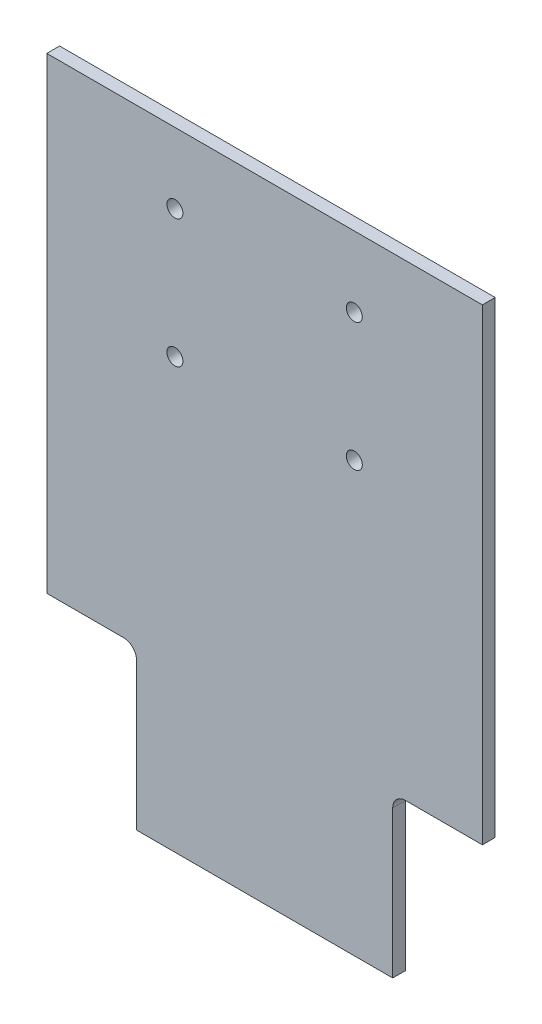
ISO-10303-21;
HEADER;
FILE_DESCRIPTION(('STEP AP214'),'2;1');
FILE_NAME('part.step','',(''),(''),'','','');
FILE_SCHEMA(('AUTOMOTIVE_DESIGN { 1 0 10303 214 1 1 1 1 }'));
ENDSEC;
DATA;
#1=APPLICATION_CONTEXT('core data for automotive mechanical design processes');
#2=APPLICATION_PROTOCOL_DEFINITION('international standard','automotive_design',2000,#1);
#3=PRODUCT_CONTEXT('',#1,'mechanical');
#4=PRODUCT('Part','Part','',(#3));
#5=PRODUCT_RELATED_PRODUCT_CATEGORY('part','',(#4));
#6=PRODUCT_DEFINITION_FORMATION('','',#4);
#7=PRODUCT_DEFINITION_CONTEXT('part definition',#1,'design');
#8=PRODUCT_DEFINITION('design','',#6,#7);
#9=PRODUCT_DEFINITION_SHAPE('','',#8);
#10=(LENGTH_UNIT() NAMED_UNIT(*) SI_UNIT(.MILLI.,.METRE.));
#11=(NAMED_UNIT(*) PLANE_ANGLE_UNIT() SI_UNIT($,.RADIAN.));
#12=(NAMED_UNIT(*) SI_UNIT($,.STERADIAN.) SOLID_ANGLE_UNIT());
#13=UNCERTAINTY_MEASURE_WITH_UNIT(LENGTH_MEASURE(1.E-05),#10,'distance_accuracy_value','');
#14=(GEOMETRIC_REPRESENTATION_CONTEXT(3) GLOBAL_UNCERTAINTY_ASSIGNED_CONTEXT((#13)) GLOBAL_UNIT_ASSIGNED_CONTEXT((#10,
#11,#12)) REPRESENTATION_CONTEXT('',''));
#15=CARTESIAN_POINT('',(0.,0.,0.));
#16=DIRECTION('',(0.,0.,1.));
#17=DIRECTION('',(1.,0.,0.));
#18=AXIS2_PLACEMENT_3D('',#15,#16,#17);
#19=CARTESIAN_POINT('',(0.,0.,2.));
#20=DIRECTION('',(0.,0.,-1.));
#21=DIRECTION('',(-1.,0.,0.));
#22=AXIS2_PLACEMENT_3D('',#19,#20,#21);
#23=PLANE('',#22);
#24=DIRECTION('',(1.,0.,0.));
#25=VECTOR('',#24,1.);
#26=CARTESIAN_POINT('',(-40.0499687890016,-40.,2.));
#27=LINE('',#26,#25);
#28=CARTESIAN_POINT('',(14.,-40.,2.));
#29=VERTEX_POINT('',#28);
#30=CARTESIAN_POINT('',(54.,-40.,2.));
#31=VERTEX_POINT('',#30);
#32=EDGE_CURVE('E243',#29,#31,#27,.T.);
#33=ORIENTED_EDGE('',*,*,#32,.T.);
#34=DIRECTION('',(0.,-1.,0.));
#35=VECTOR('',#34,1.);
#36=CARTESIAN_POINT('',(54.,-40.,2.));
#37=LINE('',#36,#35);
#38=CARTESIAN_POINT('',(54.,-17.,2.));
#39=VERTEX_POINT('',#38);
#40=EDGE_CURVE('E136',#39,#31,#37,.T.);
#41=ORIENTED_EDGE('',*,*,#40,.F.);
#42=CARTESIAN_POINT('',(56.,-17.,2.));
#43=DIRECTION('',(0.,0.,-1.));
#44=DIRECTION('',(-1.,0.,0.));
#45=AXIS2_PLACEMENT_3D('',#42,#43,#44);
#46=CIRCLE('',#45,2.);
#47=CARTESIAN_POINT('',(56.,-15.,2.));
#48=VERTEX_POINT('',#47);
#49=EDGE_CURVE('E143',#39,#48,#46,.T.);
#50=ORIENTED_EDGE('',*,*,#49,.T.);
#51=DIRECTION('',(-1.,0.,0.));
#52=VECTOR('',#51,1.);
#53=CARTESIAN_POINT('',(54.,-15.,2.));
#54=LINE('',#53,#52);
#55=CARTESIAN_POINT('',(68.,-15.,2.));
#56=VERTEX_POINT('',#55);
#57=EDGE_CURVE('E128',#56,#48,#54,.T.);
#58=ORIENTED_EDGE('',*,*,#57,.F.);
#59=DIRECTION('',(0.,1.,0.));
#60=VECTOR('',#59,1.);
#61=CARTESIAN_POINT('',(68.,0.,2.));
#62=LINE('',#61,#60);
#63=CARTESIAN_POINT('',(68.,58.,2.));
#64=VERTEX_POINT('',#63);
#65=EDGE_CURVE('E140',#56,#64,#62,.T.);
#66=ORIENTED_EDGE('',*,*,#65,.T.);
#67=DIRECTION('',(-1.,0.,0.));
#68=VECTOR('',#67,1.);
#69=CARTESIAN_POINT('',(0.,58.,2.));
#70=LINE('',#69,#68);
#71=CARTESIAN_POINT('',(0.,58.,2.));
#72=VERTEX_POINT('',#71);
#73=EDGE_CURVE('E150',#64,#72,#70,.T.);
#74=ORIENTED_EDGE('',*,*,#73,.T.);
#75=DIRECTION('',(0.,-1.,0.));
#76=VECTOR('',#75,1.);
#77=CARTESIAN_POINT('',(0.,0.,2.));
#78=LINE('',#77,#76);
#79=CARTESIAN_POINT('',(0.,-15.,2.));
#80=VERTEX_POINT('',#79);
#81=EDGE_CURVE('E151',#72,#80,#78,.T.);
#82=ORIENTED_EDGE('',*,*,#81,.T.);
#83=DIRECTION('',(-1.,0.,0.));
#84=VECTOR('',#83,1.);
#85=CARTESIAN_POINT('',(14.,-15.,2.));
#86=LINE('',#85,#84);
#87=CARTESIAN_POINT('',(12.,-15.,2.));
#88=VERTEX_POINT('',#87);
#89=EDGE_CURVE('E478',#88,#80,#86,.T.);
#90=ORIENTED_EDGE('',*,*,#89,.F.);
#91=CARTESIAN_POINT('',(12.,-17.,2.));
#92=DIRECTION('',(0.,0.,-1.));
#93=DIRECTION('',(-1.,0.,0.));
#94=AXIS2_PLACEMENT_3D('',#91,#92,#93);
#95=CIRCLE('',#94,2.);
#96=CARTESIAN_POINT('',(14.,-17.,2.));
#97=VERTEX_POINT('',#96);
#98=EDGE_CURVE('E57',#88,#97,#95,.T.);
#99=ORIENTED_EDGE('',*,*,#98,.T.);
#100=DIRECTION('',(0.,1.,0.));
#101=VECTOR('',#100,1.);
#102=CARTESIAN_POINT('',(14.,-40.,2.));
#103=LINE('',#102,#101);
#104=EDGE_CURVE('E144',#29,#97,#103,.T.);
#105=ORIENTED_EDGE('',*,*,#104,.F.);
#106=EDGE_LOOP('',(#33,#41,#50,#58,#66,#74,#82,#90,#99,#105));
#107=FACE_BOUND('',#106,.T.);
#108=CARTESIAN_POINT('',(48.,27.,2.));
#109=DIRECTION('',(0.,0.,1.));
#110=DIRECTION('',(1.,0.,0.));
#111=AXIS2_PLACEMENT_3D('',#108,#109,#110);
#112=CIRCLE('',#111,1.25);
#113=CARTESIAN_POINT('',(49.25,27.,2.));
#114=VERTEX_POINT('',#113);
#115=EDGE_CURVE('E164',#114,#114,#112,.T.);
#116=ORIENTED_EDGE('',*,*,#115,.F.);
#117=EDGE_LOOP('',(#116));
#118=FACE_BOUND('',#117,.T.);
#119=CARTESIAN_POINT('',(20.,27.,2.));
#120=DIRECTION('',(0.,0.,1.));
#121=DIRECTION('',(-1.,0.,0.));
#122=AXIS2_PLACEMENT_3D('',#119,#120,#121);
#123=CIRCLE('',#122,1.25);
#124=CARTESIAN_POINT('',(18.75,27.,2.));
#125=VERTEX_POINT('',#124);
#126=EDGE_CURVE('E263',#125,#125,#123,.T.);
#127=ORIENTED_EDGE('',*,*,#126,.F.);
#128=EDGE_LOOP('',(#127));
#129=FACE_BOUND('',#128,.T.);
#130=CARTESIAN_POINT('',(48.,47.,2.));
#131=DIRECTION('',(0.,0.,1.));
#132=DIRECTION('',(1.,0.,0.));
#133=AXIS2_PLACEMENT_3D('',#130,#131,#132);
#134=CIRCLE('',#133,1.25);
#135=CARTESIAN_POINT('',(49.25,47.,2.));
#136=VERTEX_POINT('',#135);
#137=EDGE_CURVE('E257',#136,#136,#134,.T.);
#138=ORIENTED_EDGE('',*,*,#137,.F.);
#139=EDGE_LOOP('',(#138));
#140=FACE_BOUND('',#139,.T.);
#141=CARTESIAN_POINT('',(20.,47.,2.));
#142=DIRECTION('',(0.,0.,1.));
#143=DIRECTION('',(-1.,0.,0.));
#144=AXIS2_PLACEMENT_3D('',#141,#142,#143);
#145=CIRCLE('',#144,1.25);
#146=CARTESIAN_POINT('',(18.75,47.,2.));
#147=VERTEX_POINT('',#146);
#148=EDGE_CURVE('E251',#147,#147,#145,.T.);
#149=ORIENTED_EDGE('',*,*,#148,.F.);
#150=EDGE_LOOP('',(#149));
#151=FACE_BOUND('',#150,.T.);
#152=ADVANCED_FACE('F49',(#107,#118,#129,#140,#151),#23,.F.);
#153=CARTESIAN_POINT('',(0.,0.,0.));
#154=DIRECTION('',(0.,0.,-1.));
#155=DIRECTION('',(-1.,0.,0.));
#156=AXIS2_PLACEMENT_3D('',#153,#154,#155);
#157=PLANE('',#156);
#158=DIRECTION('',(0.,1.,0.));
#159=VECTOR('',#158,1.);
#160=CARTESIAN_POINT('',(54.,0.,0.));
#161=LINE('',#160,#159);
#162=CARTESIAN_POINT('',(54.,-40.,2.79290479632266E-13));
#163=VERTEX_POINT('',#162);
#164=CARTESIAN_POINT('',(54.,-17.,0.));
#165=VERTEX_POINT('',#164);
#166=EDGE_CURVE('E192',#163,#165,#161,.T.);
#167=ORIENTED_EDGE('',*,*,#166,.F.);
#168=DIRECTION('',(1.,0.,0.));
#169=VECTOR('',#168,1.);
#170=CARTESIAN_POINT('',(-40.0499687890016,-40.,2.79318507107451E-13));
#171=LINE('',#170,#169);
#172=CARTESIAN_POINT('',(14.,-40.,2.79318507107451E-13));
#173=VERTEX_POINT('',#172);
#174=EDGE_CURVE('E245',#173,#163,#171,.T.);
#175=ORIENTED_EDGE('',*,*,#174,.F.);
#176=DIRECTION('',(0.,-1.,0.));
#177=VECTOR('',#176,1.);
#178=CARTESIAN_POINT('',(14.,0.,0.));
#179=LINE('',#178,#177);
#180=CARTESIAN_POINT('',(14.,-17.,0.));
#181=VERTEX_POINT('',#180);
#182=EDGE_CURVE('E135',#181,#173,#179,.T.);
#183=ORIENTED_EDGE('',*,*,#182,.F.);
#184=CARTESIAN_POINT('',(12.,-17.,0.));
#185=DIRECTION('',(0.,0.,-1.));
#186=DIRECTION('',(-1.,0.,0.));
#187=AXIS2_PLACEMENT_3D('',#184,#185,#186);
#188=CIRCLE('',#187,2.);
#189=CARTESIAN_POINT('',(12.,-15.,0.));
#190=VERTEX_POINT('',#189);
#191=EDGE_CURVE('E11',#181,#190,#188,.F.);
#192=ORIENTED_EDGE('',*,*,#191,.T.);
#193=DIRECTION('',(1.,0.,0.));
#194=VECTOR('',#193,1.);
#195=CARTESIAN_POINT('',(0.,-15.,0.));
#196=LINE('',#195,#194);
#197=CARTESIAN_POINT('',(0.,-15.,0.));
#198=VERTEX_POINT('',#197);
#199=EDGE_CURVE('E239',#198,#190,#196,.T.);
#200=ORIENTED_EDGE('',*,*,#199,.F.);
#201=DIRECTION('',(0.,-1.,0.));
#202=VECTOR('',#201,1.);
#203=CARTESIAN_POINT('',(0.,0.,0.));
#204=LINE('',#203,#202);
#205=CARTESIAN_POINT('',(0.,58.,0.));
#206=VERTEX_POINT('',#205);
#207=EDGE_CURVE('E160',#206,#198,#204,.T.);
#208=ORIENTED_EDGE('',*,*,#207,.F.);
#209=DIRECTION('',(-1.,0.,0.));
#210=VECTOR('',#209,1.);
#211=CARTESIAN_POINT('',(0.,58.,0.));
#212=LINE('',#211,#210);
#213=CARTESIAN_POINT('',(68.,58.,0.));
#214=VERTEX_POINT('',#213);
#215=EDGE_CURVE('E156',#214,#206,#212,.T.);
#216=ORIENTED_EDGE('',*,*,#215,.F.);
#217=DIRECTION('',(0.,1.,0.));
#218=VECTOR('',#217,1.);
#219=CARTESIAN_POINT('',(68.,0.,0.));
#220=LINE('',#219,#218);
#221=CARTESIAN_POINT('',(68.,-15.,0.));
#222=VERTEX_POINT('',#221);
#223=EDGE_CURVE('E163',#222,#214,#220,.T.);
#224=ORIENTED_EDGE('',*,*,#223,.F.);
#225=DIRECTION('',(1.,0.,0.));
#226=VECTOR('',#225,1.);
#227=CARTESIAN_POINT('',(0.,-15.,0.));
#228=LINE('',#227,#226);
#229=CARTESIAN_POINT('',(56.,-15.,0.));
#230=VERTEX_POINT('',#229);
#231=EDGE_CURVE('E131',#230,#222,#228,.T.);
#232=ORIENTED_EDGE('',*,*,#231,.F.);
#233=CARTESIAN_POINT('',(56.,-17.,0.));
#234=DIRECTION('',(0.,0.,-1.));
#235=DIRECTION('',(-1.,0.,0.));
#236=AXIS2_PLACEMENT_3D('',#233,#234,#235);
#237=CIRCLE('',#236,2.);
#238=EDGE_CURVE('E184',#230,#165,#237,.F.);
#239=ORIENTED_EDGE('',*,*,#238,.T.);
#240=EDGE_LOOP('',(#167,#175,#183,#192,#200,#208,#216,#224,#232,#239));
#241=FACE_BOUND('',#240,.T.);
#242=CARTESIAN_POINT('',(48.,47.,0.));
#243=DIRECTION('',(0.,0.,1.));
#244=DIRECTION('',(1.,0.,0.));
#245=AXIS2_PLACEMENT_3D('',#242,#243,#244);
#246=CIRCLE('',#245,1.25);
#247=CARTESIAN_POINT('',(49.25,47.,0.));
#248=VERTEX_POINT('',#247);
#249=EDGE_CURVE('E254',#248,#248,#246,.T.);
#250=ORIENTED_EDGE('',*,*,#249,.T.);
#251=EDGE_LOOP('',(#250));
#252=FACE_BOUND('',#251,.T.);
#253=CARTESIAN_POINT('',(48.,27.,0.));
#254=DIRECTION('',(0.,0.,1.));
#255=DIRECTION('',(1.,0.,0.));
#256=AXIS2_PLACEMENT_3D('',#253,#254,#255);
#257=CIRCLE('',#256,1.25);
#258=CARTESIAN_POINT('',(49.25,27.,0.));
#259=VERTEX_POINT('',#258);
#260=EDGE_CURVE('E266',#259,#259,#257,.T.);
#261=ORIENTED_EDGE('',*,*,#260,.T.);
#262=EDGE_LOOP('',(#261));
#263=FACE_BOUND('',#262,.T.);
#264=CARTESIAN_POINT('',(20.,27.,0.));
#265=DIRECTION('',(0.,0.,1.));
#266=DIRECTION('',(-1.,0.,0.));
#267=AXIS2_PLACEMENT_3D('',#264,#265,#266);
#268=CIRCLE('',#267,1.25);
#269=CARTESIAN_POINT('',(18.75,27.,0.));
#270=VERTEX_POINT('',#269);
#271=EDGE_CURVE('E260',#270,#270,#268,.T.);
#272=ORIENTED_EDGE('',*,*,#271,.T.);
#273=EDGE_LOOP('',(#272));
#274=FACE_BOUND('',#273,.T.);
#275=CARTESIAN_POINT('',(20.,47.,0.));
#276=DIRECTION('',(0.,0.,1.));
#277=DIRECTION('',(-1.,0.,0.));
#278=AXIS2_PLACEMENT_3D('',#275,#276,#277);
#279=CIRCLE('',#278,1.25);
#280=CARTESIAN_POINT('',(18.75,47.,0.));
#281=VERTEX_POINT('',#280);
#282=EDGE_CURVE('E249',#281,#281,#279,.T.);
#283=ORIENTED_EDGE('',*,*,#282,.T.);
#284=EDGE_LOOP('',(#283));
#285=FACE_BOUND('',#284,.T.);
#286=ADVANCED_FACE('F189',(#241,#252,#263,#274,#285),#157,.T.);
#287=CARTESIAN_POINT('',(0.,0.,2.));
#288=DIRECTION('',(1.,0.,0.));
#289=DIRECTION('',(0.,0.,-1.));
#290=AXIS2_PLACEMENT_3D('',#287,#288,#289);
#291=PLANE('',#290);
#292=ORIENTED_EDGE('',*,*,#207,.T.);
#293=DIRECTION('',(0.,0.,1.));
#294=VECTOR('',#293,1.);
#295=CARTESIAN_POINT('',(0.,-15.,-8.));
#296=LINE('',#295,#294);
#297=EDGE_CURVE('E234',#198,#80,#296,.T.);
#298=ORIENTED_EDGE('',*,*,#297,.T.);
#299=ORIENTED_EDGE('',*,*,#81,.F.);
#300=DIRECTION('',(0.,0.,-1.));
#301=VECTOR('',#300,1.);
#302=CARTESIAN_POINT('',(0.,58.,2.));
#303=LINE('',#302,#301);
#304=EDGE_CURVE('E153',#72,#206,#303,.T.);
#305=ORIENTED_EDGE('',*,*,#304,.T.);
#306=EDGE_LOOP('',(#292,#298,#299,#305));
#307=FACE_BOUND('',#306,.T.);
#308=ADVANCED_FACE('F215',(#307),#291,.F.);
#309=CARTESIAN_POINT('',(68.,0.,2.));
#310=DIRECTION('',(-1.,0.,0.));
#311=DIRECTION('',(0.,-1.,0.));
#312=AXIS2_PLACEMENT_3D('',#309,#310,#311);
#313=PLANE('',#312);
#314=ORIENTED_EDGE('',*,*,#65,.F.);
#315=DIRECTION('',(0.,0.,1.));
#316=VECTOR('',#315,1.);
#317=CARTESIAN_POINT('',(68.,-15.,-8.));
#318=LINE('',#317,#316);
#319=EDGE_CURVE('E125',#222,#56,#318,.T.);
#320=ORIENTED_EDGE('',*,*,#319,.F.);
#321=ORIENTED_EDGE('',*,*,#223,.T.);
#322=DIRECTION('',(0.,0.,-1.));
#323=VECTOR('',#322,1.);
#324=CARTESIAN_POINT('',(68.,58.,2.));
#325=LINE('',#324,#323);
#326=EDGE_CURVE('E148',#64,#214,#325,.T.);
#327=ORIENTED_EDGE('',*,*,#326,.F.);
#328=EDGE_LOOP('',(#314,#320,#321,#327));
#329=FACE_BOUND('',#328,.T.);
#330=ADVANCED_FACE('F146',(#329),#313,.F.);
#331=CARTESIAN_POINT('',(0.,58.,2.));
#332=DIRECTION('',(0.,-1.,0.));
#333=DIRECTION('',(1.,0.,0.));
#334=AXIS2_PLACEMENT_3D('',#331,#332,#333);
#335=PLANE('',#334);
#336=ORIENTED_EDGE('',*,*,#215,.T.);
#337=ORIENTED_EDGE('',*,*,#304,.F.);
#338=ORIENTED_EDGE('',*,*,#73,.F.);
#339=ORIENTED_EDGE('',*,*,#326,.T.);
#340=EDGE_LOOP('',(#336,#337,#338,#339));
#341=FACE_BOUND('',#340,.T.);
#342=ADVANCED_FACE('F221',(#341),#335,.F.);
#343=CARTESIAN_POINT('',(48.,27.,2.));
#344=DIRECTION('',(0.,0.,-1.));
#345=DIRECTION('',(-1.,0.,0.));
#346=AXIS2_PLACEMENT_3D('',#343,#344,#345);
#347=CYLINDRICAL_SURFACE('',#346,1.25);
#348=ORIENTED_EDGE('',*,*,#115,.T.);
#349=EDGE_LOOP('',(#348));
#350=FACE_BOUND('',#349,.T.);
#351=ORIENTED_EDGE('',*,*,#260,.F.);
#352=EDGE_LOOP('',(#351));
#353=FACE_BOUND('',#352,.T.);
#354=ADVANCED_FACE('F218',(#350,#353),#347,.F.);
#355=CARTESIAN_POINT('',(20.,27.,2.));
#356=DIRECTION('',(0.,0.,-1.));
#357=DIRECTION('',(-1.,0.,0.));
#358=AXIS2_PLACEMENT_3D('',#355,#356,#357);
#359=CYLINDRICAL_SURFACE('',#358,1.25);
#360=ORIENTED_EDGE('',*,*,#126,.T.);
#361=EDGE_LOOP('',(#360));
#362=FACE_BOUND('',#361,.T.);
#363=ORIENTED_EDGE('',*,*,#271,.F.);
#364=EDGE_LOOP('',(#363));
#365=FACE_BOUND('',#364,.T.);
#366=ADVANCED_FACE('F276',(#362,#365),#359,.F.);
#367=CARTESIAN_POINT('',(48.,47.,2.));
#368=DIRECTION('',(0.,0.,-1.));
#369=DIRECTION('',(-1.,0.,0.));
#370=AXIS2_PLACEMENT_3D('',#367,#368,#369);
#371=CYLINDRICAL_SURFACE('',#370,1.25);
#372=ORIENTED_EDGE('',*,*,#137,.T.);
#373=EDGE_LOOP('',(#372));
#374=FACE_BOUND('',#373,.T.);
#375=ORIENTED_EDGE('',*,*,#249,.F.);
#376=EDGE_LOOP('',(#375));
#377=FACE_BOUND('',#376,.T.);
#378=ADVANCED_FACE('F281',(#374,#377),#371,.F.);
#379=CARTESIAN_POINT('',(20.,47.,2.));
#380=DIRECTION('',(0.,0.,-1.));
#381=DIRECTION('',(-1.,0.,0.));
#382=AXIS2_PLACEMENT_3D('',#379,#380,#381);
#383=CYLINDRICAL_SURFACE('',#382,1.25);
#384=ORIENTED_EDGE('',*,*,#148,.T.);
#385=EDGE_LOOP('',(#384));
#386=FACE_BOUND('',#385,.T.);
#387=ORIENTED_EDGE('',*,*,#282,.F.);
#388=EDGE_LOOP('',(#387));
#389=FACE_BOUND('',#388,.T.);
#390=ADVANCED_FACE('F291',(#386,#389),#383,.F.);
#391=CARTESIAN_POINT('',(-40.0499687890016,-40.,2.79318507107451E-13));
#392=DIRECTION('',(0.,-1.,0.));
#393=DIRECTION('',(0.,0.,-1.));
#394=AXIS2_PLACEMENT_3D('',#391,#392,#393);
#395=PLANE('',#394);
#396=DIRECTION('',(0.,0.,-1.));
#397=VECTOR('',#396,1.);
#398=CARTESIAN_POINT('',(54.,-40.,2.79318507107451E-13));
#399=LINE('',#398,#397);
#400=EDGE_CURVE('E172',#31,#163,#399,.T.);
#401=ORIENTED_EDGE('',*,*,#400,.F.);
#402=ORIENTED_EDGE('',*,*,#32,.F.);
#403=DIRECTION('',(0.,0.,1.));
#404=VECTOR('',#403,1.);
#405=CARTESIAN_POINT('',(14.,-40.,2.79318507107451E-13));
#406=LINE('',#405,#404);
#407=EDGE_CURVE('E170',#173,#29,#406,.T.);
#408=ORIENTED_EDGE('',*,*,#407,.F.);
#409=ORIENTED_EDGE('',*,*,#174,.T.);
#410=EDGE_LOOP('',(#401,#402,#408,#409));
#411=FACE_BOUND('',#410,.T.);
#412=ADVANCED_FACE('F294',(#411),#395,.T.);
#413=CARTESIAN_POINT('',(14.,-15.,-8.));
#414=DIRECTION('',(0.,1.,0.));
#415=DIRECTION('',(0.,0.,1.));
#416=AXIS2_PLACEMENT_3D('',#413,#414,#415);
#417=PLANE('',#416);
#418=ORIENTED_EDGE('',*,*,#199,.T.);
#419=DIRECTION('',(0.,0.,1.));
#420=VECTOR('',#419,1.);
#421=CARTESIAN_POINT('',(12.,-15.,2.));
#422=LINE('',#421,#420);
#423=EDGE_CURVE('E179',#190,#88,#422,.T.);
#424=ORIENTED_EDGE('',*,*,#423,.T.);
#425=ORIENTED_EDGE('',*,*,#89,.T.);
#426=ORIENTED_EDGE('',*,*,#297,.F.);
#427=EDGE_LOOP('',(#418,#424,#425,#426));
#428=FACE_BOUND('',#427,.T.);
#429=ADVANCED_FACE('F301',(#428),#417,.F.);
#430=CARTESIAN_POINT('',(14.,-40.,-8.));
#431=DIRECTION('',(1.,0.,0.));
#432=DIRECTION('',(0.,0.,-1.));
#433=AXIS2_PLACEMENT_3D('',#430,#431,#432);
#434=PLANE('',#433);
#435=ORIENTED_EDGE('',*,*,#104,.T.);
#436=DIRECTION('',(0.,0.,1.));
#437=VECTOR('',#436,1.);
#438=CARTESIAN_POINT('',(14.,-17.,0.));
#439=LINE('',#438,#437);
#440=EDGE_CURVE('E70',#97,#181,#439,.F.);
#441=ORIENTED_EDGE('',*,*,#440,.T.);
#442=ORIENTED_EDGE('',*,*,#182,.T.);
#443=ORIENTED_EDGE('',*,*,#407,.T.);
#444=EDGE_LOOP('',(#435,#441,#442,#443));
#445=FACE_BOUND('',#444,.T.);
#446=ADVANCED_FACE('F309',(#445),#434,.F.);
#447=CARTESIAN_POINT('',(54.,-40.,-8.));
#448=DIRECTION('',(-1.,0.,0.));
#449=DIRECTION('',(0.,0.,1.));
#450=AXIS2_PLACEMENT_3D('',#447,#448,#449);
#451=PLANE('',#450);
#452=ORIENTED_EDGE('',*,*,#166,.T.);
#453=DIRECTION('',(0.,0.,1.));
#454=VECTOR('',#453,1.);
#455=CARTESIAN_POINT('',(54.,-17.,2.));
#456=LINE('',#455,#454);
#457=EDGE_CURVE('E174',#165,#39,#456,.T.);
#458=ORIENTED_EDGE('',*,*,#457,.T.);
#459=ORIENTED_EDGE('',*,*,#40,.T.);
#460=ORIENTED_EDGE('',*,*,#400,.T.);
#461=EDGE_LOOP('',(#452,#458,#459,#460));
#462=FACE_BOUND('',#461,.T.);
#463=ADVANCED_FACE('F197',(#462),#451,.F.);
#464=CARTESIAN_POINT('',(54.,-15.,-8.));
#465=DIRECTION('',(0.,1.,0.));
#466=DIRECTION('',(0.,0.,1.));
#467=AXIS2_PLACEMENT_3D('',#464,#465,#466);
#468=PLANE('',#467);
#469=ORIENTED_EDGE('',*,*,#57,.T.);
#470=DIRECTION('',(0.,0.,1.));
#471=VECTOR('',#470,1.);
#472=CARTESIAN_POINT('',(56.,-15.,0.));
#473=LINE('',#472,#471);
#474=EDGE_CURVE('E177',#48,#230,#473,.F.);
#475=ORIENTED_EDGE('',*,*,#474,.T.);
#476=ORIENTED_EDGE('',*,*,#231,.T.);
#477=ORIENTED_EDGE('',*,*,#319,.T.);
#478=EDGE_LOOP('',(#469,#475,#476,#477));
#479=FACE_BOUND('',#478,.T.);
#480=ADVANCED_FACE('F127',(#479),#468,.F.);
#481=CARTESIAN_POINT('',(56.,-17.,-8.));
#482=DIRECTION('',(0.,0.,-1.));
#483=DIRECTION('',(-1.,0.,0.));
#484=AXIS2_PLACEMENT_3D('',#481,#482,#483);
#485=CYLINDRICAL_SURFACE('',#484,2.);
#486=ORIENTED_EDGE('',*,*,#238,.F.);
#487=ORIENTED_EDGE('',*,*,#474,.F.);
#488=ORIENTED_EDGE('',*,*,#49,.F.);
#489=ORIENTED_EDGE('',*,*,#457,.F.);
#490=EDGE_LOOP('',(#486,#487,#488,#489));
#491=FACE_BOUND('',#490,.T.);
#492=ADVANCED_FACE('F200',(#491),#485,.F.);
#493=CARTESIAN_POINT('',(12.,-17.,-8.));
#494=DIRECTION('',(0.,0.,-1.));
#495=DIRECTION('',(-1.,0.,0.));
#496=AXIS2_PLACEMENT_3D('',#493,#494,#495);
#497=CYLINDRICAL_SURFACE('',#496,2.);
#498=ORIENTED_EDGE('',*,*,#191,.F.);
#499=ORIENTED_EDGE('',*,*,#440,.F.);
#500=ORIENTED_EDGE('',*,*,#98,.F.);
#501=ORIENTED_EDGE('',*,*,#423,.F.);
#502=EDGE_LOOP('',(#498,#499,#500,#501));
#503=FACE_BOUND('',#502,.T.);
#504=ADVANCED_FACE('F51',(#503),#497,.F.);
#505=CLOSED_SHELL('',(#152,#286,#308,#330,#342,#354,#366,#378,#390,#412,#429,#446,#463,#480,
#492,#504));
#506=MANIFOLD_SOLID_BREP('B2',#505);
#507=ADVANCED_BREP_SHAPE_REPRESENTATION('',(#18,#506),#14);
#508=SHAPE_DEFINITION_REPRESENTATION(#9,#507);
ENDSEC;
END-ISO-10303-21;
